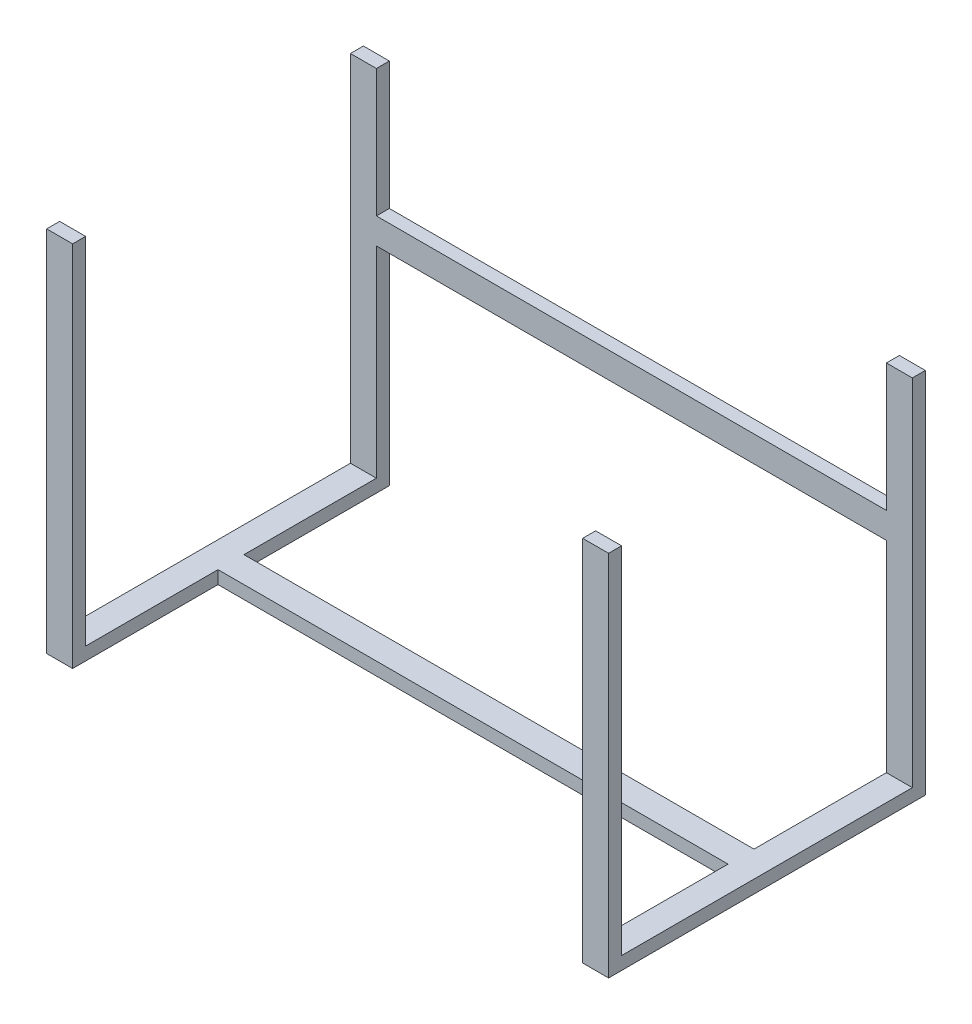
ISO-10303-21;
HEADER;
FILE_DESCRIPTION(('STEP AP214'),'2;1');
FILE_NAME('part.step','',(''),(''),'','','');
FILE_SCHEMA(('AUTOMOTIVE_DESIGN { 1 0 10303 214 1 1 1 1 }'));
ENDSEC;
DATA;
#1=APPLICATION_CONTEXT('core data for automotive mechanical design processes');
#2=APPLICATION_PROTOCOL_DEFINITION('international standard','automotive_design',2000,#1);
#3=PRODUCT_CONTEXT('',#1,'mechanical');
#4=PRODUCT('Part','Part','',(#3));
#5=PRODUCT_RELATED_PRODUCT_CATEGORY('part','',(#4));
#6=PRODUCT_DEFINITION_FORMATION('','',#4);
#7=PRODUCT_DEFINITION_CONTEXT('part definition',#1,'design');
#8=PRODUCT_DEFINITION('design','',#6,#7);
#9=PRODUCT_DEFINITION_SHAPE('','',#8);
#10=(LENGTH_UNIT() NAMED_UNIT(*) SI_UNIT(.MILLI.,.METRE.));
#11=(NAMED_UNIT(*) PLANE_ANGLE_UNIT() SI_UNIT($,.RADIAN.));
#12=(NAMED_UNIT(*) SI_UNIT($,.STERADIAN.) SOLID_ANGLE_UNIT());
#13=UNCERTAINTY_MEASURE_WITH_UNIT(LENGTH_MEASURE(1.E-05),#10,'distance_accuracy_value','');
#14=(GEOMETRIC_REPRESENTATION_CONTEXT(3) GLOBAL_UNCERTAINTY_ASSIGNED_CONTEXT((#13)) GLOBAL_UNIT_ASSIGNED_CONTEXT((#10,
#11,#12)) REPRESENTATION_CONTEXT('',''));
#15=CARTESIAN_POINT('',(0.,0.,0.));
#16=DIRECTION('',(0.,0.,1.));
#17=DIRECTION('',(1.,0.,0.));
#18=AXIS2_PLACEMENT_3D('',#15,#16,#17);
#19=CARTESIAN_POINT('',(50.8,0.,0.));
#20=DIRECTION('',(-1.,0.,0.));
#21=DIRECTION('',(0.,0.,1.));
#22=AXIS2_PLACEMENT_3D('',#19,#20,#21);
#23=PLANE('',#22);
#24=DIRECTION('',(0.,0.,-1.));
#25=VECTOR('',#24,1.);
#26=CARTESIAN_POINT('',(50.8,419.2,25.4));
#27=LINE('',#26,#25);
#28=CARTESIAN_POINT('',(50.8,419.2,25.4));
#29=VERTEX_POINT('',#28);
#30=CARTESIAN_POINT('',(50.8,419.2,0.));
#31=VERTEX_POINT('',#30);
#32=EDGE_CURVE('E51',#29,#31,#27,.T.);
#33=ORIENTED_EDGE('',*,*,#32,.F.);
#34=DIRECTION('',(0.,-1.,0.));
#35=VECTOR('',#34,1.);
#36=CARTESIAN_POINT('',(50.8,25.4,25.4));
#37=LINE('',#36,#35);
#38=CARTESIAN_POINT('',(50.8,25.4,25.4));
#39=VERTEX_POINT('',#38);
#40=EDGE_CURVE('E217',#29,#39,#37,.T.);
#41=ORIENTED_EDGE('',*,*,#40,.T.);
#42=DIRECTION('',(0.,0.,1.));
#43=VECTOR('',#42,1.);
#44=CARTESIAN_POINT('',(50.8,25.3999999999999,594.6));
#45=LINE('',#44,#43);
#46=CARTESIAN_POINT('',(50.8,25.4,284.6));
#47=VERTEX_POINT('',#46);
#48=EDGE_CURVE('E322',#39,#47,#45,.T.);
#49=ORIENTED_EDGE('',*,*,#48,.T.);
#50=DIRECTION('',(0.,1.,0.));
#51=VECTOR('',#50,1.);
#52=CARTESIAN_POINT('',(50.8,25.4,284.6));
#53=LINE('',#52,#51);
#54=CARTESIAN_POINT('',(50.8,0.,284.6));
#55=VERTEX_POINT('',#54);
#56=EDGE_CURVE('E301',#55,#47,#53,.T.);
#57=ORIENTED_EDGE('',*,*,#56,.F.);
#58=DIRECTION('',(0.,0.,-1.));
#59=VECTOR('',#58,1.);
#60=CARTESIAN_POINT('',(50.8,0.,0.));
#61=LINE('',#60,#59);
#62=CARTESIAN_POINT('',(50.8,0.,0.));
#63=VERTEX_POINT('',#62);
#64=EDGE_CURVE('E330',#55,#63,#61,.T.);
#65=ORIENTED_EDGE('',*,*,#64,.T.);
#66=DIRECTION('',(0.,1.,0.));
#67=VECTOR('',#66,1.);
#68=CARTESIAN_POINT('',(50.8,720.,0.));
#69=LINE('',#68,#67);
#70=EDGE_CURVE('E334',#63,#31,#69,.T.);
#71=ORIENTED_EDGE('',*,*,#70,.T.);
#72=EDGE_LOOP('',(#33,#41,#49,#57,#65,#71));
#73=FACE_BOUND('',#72,.T.);
#74=ADVANCED_FACE('F36',(#73),#23,.F.);
#75=DIRECTION('',(0.,0.,1.));
#76=VECTOR('',#75,1.);
#77=CARTESIAN_POINT('',(50.8,470.,25.4));
#78=LINE('',#77,#76);
#79=CARTESIAN_POINT('',(50.8,470.,0.));
#80=VERTEX_POINT('',#79);
#81=CARTESIAN_POINT('',(50.8,470.,25.4));
#82=VERTEX_POINT('',#81);
#83=EDGE_CURVE('E407',#80,#82,#78,.T.);
#84=ORIENTED_EDGE('',*,*,#83,.F.);
#85=CARTESIAN_POINT('',(50.8,720.,0.));
#86=VERTEX_POINT('',#85);
#87=EDGE_CURVE('E333',#80,#86,#69,.T.);
#88=ORIENTED_EDGE('',*,*,#87,.T.);
#89=DIRECTION('',(0.,0.,1.));
#90=VECTOR('',#89,1.);
#91=CARTESIAN_POINT('',(50.8,720.,25.4));
#92=LINE('',#91,#90);
#93=CARTESIAN_POINT('',(50.8,720.,25.4));
#94=VERTEX_POINT('',#93);
#95=EDGE_CURVE('E317',#86,#94,#92,.T.);
#96=ORIENTED_EDGE('',*,*,#95,.T.);
#97=EDGE_CURVE('E59',#94,#82,#37,.T.);
#98=ORIENTED_EDGE('',*,*,#97,.T.);
#99=EDGE_LOOP('',(#84,#88,#96,#98));
#100=FACE_BOUND('',#99,.T.);
#101=ADVANCED_FACE('F416',(#100),#23,.F.);
#102=CARTESIAN_POINT('',(1049.2,0.,0.));
#103=DIRECTION('',(1.,0.,0.));
#104=DIRECTION('',(0.,0.,1.));
#105=AXIS2_PLACEMENT_3D('',#102,#103,#104);
#106=PLANE('',#105);
#107=DIRECTION('',(0.,0.,-1.));
#108=VECTOR('',#107,1.);
#109=CARTESIAN_POINT('',(1049.2,419.2,25.4));
#110=LINE('',#109,#108);
#111=CARTESIAN_POINT('',(1049.2,419.2,25.4));
#112=VERTEX_POINT('',#111);
#113=CARTESIAN_POINT('',(1049.2,419.2,0.));
#114=VERTEX_POINT('',#113);
#115=EDGE_CURVE('E198',#112,#114,#110,.T.);
#116=ORIENTED_EDGE('',*,*,#115,.T.);
#117=DIRECTION('',(0.,1.,0.));
#118=VECTOR('',#117,1.);
#119=CARTESIAN_POINT('',(1049.2,720.,0.));
#120=LINE('',#119,#118);
#121=CARTESIAN_POINT('',(1049.2,0.,0.));
#122=VERTEX_POINT('',#121);
#123=EDGE_CURVE('E250',#122,#114,#120,.T.);
#124=ORIENTED_EDGE('',*,*,#123,.F.);
#125=DIRECTION('',(0.,0.,-1.));
#126=VECTOR('',#125,1.);
#127=CARTESIAN_POINT('',(1049.2,0.,0.));
#128=LINE('',#127,#126);
#129=CARTESIAN_POINT('',(1049.2,0.,284.6));
#130=VERTEX_POINT('',#129);
#131=EDGE_CURVE('E245',#130,#122,#128,.T.);
#132=ORIENTED_EDGE('',*,*,#131,.F.);
#133=DIRECTION('',(0.,1.,0.));
#134=VECTOR('',#133,1.);
#135=CARTESIAN_POINT('',(1049.2,25.4,284.6));
#136=LINE('',#135,#134);
#137=CARTESIAN_POINT('',(1049.2,25.4,284.6));
#138=VERTEX_POINT('',#137);
#139=EDGE_CURVE('E257',#130,#138,#136,.T.);
#140=ORIENTED_EDGE('',*,*,#139,.T.);
#141=DIRECTION('',(0.,0.,1.));
#142=VECTOR('',#141,1.);
#143=CARTESIAN_POINT('',(1049.2,25.3999999999999,594.6));
#144=LINE('',#143,#142);
#145=CARTESIAN_POINT('',(1049.2,25.4,25.4));
#146=VERTEX_POINT('',#145);
#147=EDGE_CURVE('E224',#146,#138,#144,.T.);
#148=ORIENTED_EDGE('',*,*,#147,.F.);
#149=DIRECTION('',(0.,-1.,0.));
#150=VECTOR('',#149,1.);
#151=CARTESIAN_POINT('',(1049.2,25.4,25.4));
#152=LINE('',#151,#150);
#153=EDGE_CURVE('E214',#112,#146,#152,.T.);
#154=ORIENTED_EDGE('',*,*,#153,.F.);
#155=EDGE_LOOP('',(#116,#124,#132,#140,#148,#154));
#156=FACE_BOUND('',#155,.T.);
#157=ADVANCED_FACE('F221',(#156),#106,.F.);
#158=DIRECTION('',(0.,0.,1.));
#159=VECTOR('',#158,1.);
#160=CARTESIAN_POINT('',(1049.2,470.,25.4));
#161=LINE('',#160,#159);
#162=CARTESIAN_POINT('',(1049.2,470.,0.));
#163=VERTEX_POINT('',#162);
#164=CARTESIAN_POINT('',(1049.2,470.,25.4));
#165=VERTEX_POINT('',#164);
#166=EDGE_CURVE('E209',#163,#165,#161,.T.);
#167=ORIENTED_EDGE('',*,*,#166,.T.);
#168=CARTESIAN_POINT('',(1049.2,720.,25.4));
#169=VERTEX_POINT('',#168);
#170=EDGE_CURVE('E225',#169,#165,#152,.T.);
#171=ORIENTED_EDGE('',*,*,#170,.F.);
#172=DIRECTION('',(0.,0.,1.));
#173=VECTOR('',#172,1.);
#174=CARTESIAN_POINT('',(1049.2,720.,25.4));
#175=LINE('',#174,#173);
#176=CARTESIAN_POINT('',(1049.2,720.,0.));
#177=VERTEX_POINT('',#176);
#178=EDGE_CURVE('E226',#177,#169,#175,.T.);
#179=ORIENTED_EDGE('',*,*,#178,.F.);
#180=EDGE_CURVE('E249',#163,#177,#120,.T.);
#181=ORIENTED_EDGE('',*,*,#180,.F.);
#182=EDGE_LOOP('',(#167,#171,#179,#181));
#183=FACE_BOUND('',#182,.T.);
#184=ADVANCED_FACE('F427',(#183),#106,.F.);
#185=DIRECTION('',(0.,-1.,0.));
#186=VECTOR('',#185,1.);
#187=CARTESIAN_POINT('',(50.8,25.4,335.4));
#188=LINE('',#187,#186);
#189=CARTESIAN_POINT('',(50.8,25.3999999999999,335.4));
#190=VERTEX_POINT('',#189);
#191=CARTESIAN_POINT('',(50.8,0.,335.4));
#192=VERTEX_POINT('',#191);
#193=EDGE_CURVE('E298',#190,#192,#188,.T.);
#194=ORIENTED_EDGE('',*,*,#193,.F.);
#195=CARTESIAN_POINT('',(50.8,25.3999999999999,594.6));
#196=VERTEX_POINT('',#195);
#197=EDGE_CURVE('E321',#190,#196,#45,.T.);
#198=ORIENTED_EDGE('',*,*,#197,.T.);
#199=DIRECTION('',(0.,1.,0.));
#200=VECTOR('',#199,1.);
#201=CARTESIAN_POINT('',(50.8,720.,594.6));
#202=LINE('',#201,#200);
#203=CARTESIAN_POINT('',(50.8,720.,594.6));
#204=VERTEX_POINT('',#203);
#205=EDGE_CURVE('E324',#196,#204,#202,.T.);
#206=ORIENTED_EDGE('',*,*,#205,.T.);
#207=DIRECTION('',(0.,0.,1.));
#208=VECTOR('',#207,1.);
#209=CARTESIAN_POINT('',(50.8,720.,620.));
#210=LINE('',#209,#208);
#211=CARTESIAN_POINT('',(50.8,720.,620.));
#212=VERTEX_POINT('',#211);
#213=EDGE_CURVE('E326',#204,#212,#210,.T.);
#214=ORIENTED_EDGE('',*,*,#213,.T.);
#215=DIRECTION('',(0.,-1.,0.));
#216=VECTOR('',#215,1.);
#217=CARTESIAN_POINT('',(50.8,0.,620.));
#218=LINE('',#217,#216);
#219=CARTESIAN_POINT('',(50.8,0.,620.));
#220=VERTEX_POINT('',#219);
#221=EDGE_CURVE('E328',#212,#220,#218,.T.);
#222=ORIENTED_EDGE('',*,*,#221,.T.);
#223=EDGE_CURVE('E331',#220,#192,#61,.T.);
#224=ORIENTED_EDGE('',*,*,#223,.T.);
#225=EDGE_LOOP('',(#194,#198,#206,#214,#222,#224));
#226=FACE_BOUND('',#225,.T.);
#227=ADVANCED_FACE('F390',(#226),#23,.F.);
#228=CARTESIAN_POINT('',(50.8,720.,25.4));
#229=DIRECTION('',(0.,-1.,0.));
#230=DIRECTION('',(0.,0.,-1.));
#231=AXIS2_PLACEMENT_3D('',#228,#229,#230);
#232=PLANE('',#231);
#233=DIRECTION('',(0.,0.,1.));
#234=VECTOR('',#233,1.);
#235=CARTESIAN_POINT('',(0.,720.,25.4));
#236=LINE('',#235,#234);
#237=CARTESIAN_POINT('',(0.,720.,0.));
#238=VERTEX_POINT('',#237);
#239=CARTESIAN_POINT('',(0.,720.,25.4));
#240=VERTEX_POINT('',#239);
#241=EDGE_CURVE('E316',#238,#240,#236,.T.);
#242=ORIENTED_EDGE('',*,*,#241,.T.);
#243=DIRECTION('',(-1.,0.,0.));
#244=VECTOR('',#243,1.);
#245=CARTESIAN_POINT('',(50.8,720.,25.4));
#246=LINE('',#245,#244);
#247=EDGE_CURVE('E11',#94,#240,#246,.T.);
#248=ORIENTED_EDGE('',*,*,#247,.F.);
#249=ORIENTED_EDGE('',*,*,#95,.F.);
#250=DIRECTION('',(-1.,0.,0.));
#251=VECTOR('',#250,1.);
#252=CARTESIAN_POINT('',(50.8,720.,0.));
#253=LINE('',#252,#251);
#254=EDGE_CURVE('E336',#86,#238,#253,.T.);
#255=ORIENTED_EDGE('',*,*,#254,.T.);
#256=EDGE_LOOP('',(#242,#248,#249,#255));
#257=FACE_BOUND('',#256,.T.);
#258=ADVANCED_FACE('F38',(#257),#232,.F.);
#259=CARTESIAN_POINT('',(50.8,25.4,25.4));
#260=DIRECTION('',(0.,0.,-1.));
#261=DIRECTION('',(0.,1.,0.));
#262=AXIS2_PLACEMENT_3D('',#259,#260,#261);
#263=PLANE('',#262);
#264=DIRECTION('',(0.,-1.,0.));
#265=VECTOR('',#264,1.);
#266=CARTESIAN_POINT('',(0.,25.4,25.4));
#267=LINE('',#266,#265);
#268=CARTESIAN_POINT('',(0.,25.4,25.4));
#269=VERTEX_POINT('',#268);
#270=EDGE_CURVE('E339',#240,#269,#267,.T.);
#271=ORIENTED_EDGE('',*,*,#270,.T.);
#272=DIRECTION('',(-1.,0.,0.));
#273=VECTOR('',#272,1.);
#274=CARTESIAN_POINT('',(50.8,25.4,25.4));
#275=LINE('',#274,#273);
#276=EDGE_CURVE('E44',#39,#269,#275,.T.);
#277=ORIENTED_EDGE('',*,*,#276,.F.);
#278=ORIENTED_EDGE('',*,*,#40,.F.);
#279=DIRECTION('',(-1.,0.,0.));
#280=VECTOR('',#279,1.);
#281=CARTESIAN_POINT('',(1105.99612662849,419.2,25.4));
#282=LINE('',#281,#280);
#283=EDGE_CURVE('E201',#112,#29,#282,.T.);
#284=ORIENTED_EDGE('',*,*,#283,.F.);
#285=ORIENTED_EDGE('',*,*,#153,.T.);
#286=DIRECTION('',(1.,0.,0.));
#287=VECTOR('',#286,1.);
#288=CARTESIAN_POINT('',(1049.2,25.4,25.4));
#289=LINE('',#288,#287);
#290=CARTESIAN_POINT('',(1100.,25.4,25.4));
#291=VERTEX_POINT('',#290);
#292=EDGE_CURVE('E293',#146,#291,#289,.T.);
#293=ORIENTED_EDGE('',*,*,#292,.T.);
#294=DIRECTION('',(0.,-1.,0.));
#295=VECTOR('',#294,1.);
#296=CARTESIAN_POINT('',(1100.,25.4,25.4));
#297=LINE('',#296,#295);
#298=CARTESIAN_POINT('',(1100.,720.,25.4));
#299=VERTEX_POINT('',#298);
#300=EDGE_CURVE('E256',#299,#291,#297,.T.);
#301=ORIENTED_EDGE('',*,*,#300,.F.);
#302=DIRECTION('',(1.,0.,0.));
#303=VECTOR('',#302,1.);
#304=CARTESIAN_POINT('',(1049.2,720.,25.4));
#305=LINE('',#304,#303);
#306=EDGE_CURVE('E295',#169,#299,#305,.T.);
#307=ORIENTED_EDGE('',*,*,#306,.F.);
#308=ORIENTED_EDGE('',*,*,#170,.T.);
#309=DIRECTION('',(-1.,0.,0.));
#310=VECTOR('',#309,1.);
#311=CARTESIAN_POINT('',(1105.99612662849,470.,25.4));
#312=LINE('',#311,#310);
#313=EDGE_CURVE('E218',#165,#82,#312,.T.);
#314=ORIENTED_EDGE('',*,*,#313,.T.);
#315=ORIENTED_EDGE('',*,*,#97,.F.);
#316=ORIENTED_EDGE('',*,*,#247,.T.);
#317=EDGE_LOOP('',(#271,#277,#278,#284,#285,#293,#301,#307,#308,#314,#315,#316));
#318=FACE_BOUND('',#317,.T.);
#319=ADVANCED_FACE('F212',(#318),#263,.F.);
#320=CARTESIAN_POINT('',(50.8,25.3999999999999,594.6));
#321=DIRECTION('',(0.,-1.,0.));
#322=DIRECTION('',(0.,0.,-1.));
#323=AXIS2_PLACEMENT_3D('',#320,#321,#322);
#324=PLANE('',#323);
#325=DIRECTION('',(0.,0.,1.));
#326=VECTOR('',#325,1.);
#327=CARTESIAN_POINT('',(0.,25.3999999999999,594.6));
#328=LINE('',#327,#326);
#329=CARTESIAN_POINT('',(0.,25.3999999999999,594.6));
#330=VERTEX_POINT('',#329);
#331=EDGE_CURVE('E341',#269,#330,#328,.T.);
#332=ORIENTED_EDGE('',*,*,#331,.T.);
#333=DIRECTION('',(-1.,0.,0.));
#334=VECTOR('',#333,1.);
#335=CARTESIAN_POINT('',(50.8,25.3999999999999,594.6));
#336=LINE('',#335,#334);
#337=EDGE_CURVE('E366',#196,#330,#336,.T.);
#338=ORIENTED_EDGE('',*,*,#337,.F.);
#339=ORIENTED_EDGE('',*,*,#197,.F.);
#340=DIRECTION('',(-1.,0.,0.));
#341=VECTOR('',#340,1.);
#342=CARTESIAN_POINT('',(550.,25.4,335.4));
#343=LINE('',#342,#341);
#344=CARTESIAN_POINT('',(1049.2,25.3999999999999,335.4));
#345=VERTEX_POINT('',#344);
#346=EDGE_CURVE('E304',#345,#190,#343,.T.);
#347=ORIENTED_EDGE('',*,*,#346,.F.);
#348=CARTESIAN_POINT('',(1049.2,25.3999999999999,594.6));
#349=VERTEX_POINT('',#348);
#350=EDGE_CURVE('E229',#345,#349,#144,.T.);
#351=ORIENTED_EDGE('',*,*,#350,.T.);
#352=DIRECTION('',(1.,0.,0.));
#353=VECTOR('',#352,1.);
#354=CARTESIAN_POINT('',(1049.2,25.3999999999999,594.6));
#355=LINE('',#354,#353);
#356=CARTESIAN_POINT('',(1100.,25.3999999999999,594.6));
#357=VERTEX_POINT('',#356);
#358=EDGE_CURVE('E290',#349,#357,#355,.T.);
#359=ORIENTED_EDGE('',*,*,#358,.T.);
#360=DIRECTION('',(0.,0.,1.));
#361=VECTOR('',#360,1.);
#362=CARTESIAN_POINT('',(1100.,25.3999999999999,594.6));
#363=LINE('',#362,#361);
#364=EDGE_CURVE('E260',#291,#357,#363,.T.);
#365=ORIENTED_EDGE('',*,*,#364,.F.);
#366=ORIENTED_EDGE('',*,*,#292,.F.);
#367=ORIENTED_EDGE('',*,*,#147,.T.);
#368=DIRECTION('',(-1.,0.,0.));
#369=VECTOR('',#368,1.);
#370=CARTESIAN_POINT('',(550.,25.4,284.6));
#371=LINE('',#370,#369);
#372=EDGE_CURVE('E307',#138,#47,#371,.T.);
#373=ORIENTED_EDGE('',*,*,#372,.T.);
#374=ORIENTED_EDGE('',*,*,#48,.F.);
#375=ORIENTED_EDGE('',*,*,#276,.T.);
#376=EDGE_LOOP('',(#332,#338,#339,#347,#351,#359,#365,#366,#367,#373,#374,#375));
#377=FACE_BOUND('',#376,.T.);
#378=ADVANCED_FACE('F372',(#377),#324,.F.);
#379=CARTESIAN_POINT('',(50.8,720.,594.6));
#380=DIRECTION('',(0.,0.,1.));
#381=DIRECTION('',(0.,-1.,0.));
#382=AXIS2_PLACEMENT_3D('',#379,#380,#381);
#383=PLANE('',#382);
#384=DIRECTION('',(0.,1.,0.));
#385=VECTOR('',#384,1.);
#386=CARTESIAN_POINT('',(0.,720.,594.6));
#387=LINE('',#386,#385);
#388=CARTESIAN_POINT('',(0.,720.,594.6));
#389=VERTEX_POINT('',#388);
#390=EDGE_CURVE('E343',#330,#389,#387,.T.);
#391=ORIENTED_EDGE('',*,*,#390,.T.);
#392=DIRECTION('',(-1.,0.,0.));
#393=VECTOR('',#392,1.);
#394=CARTESIAN_POINT('',(50.8,720.,594.6));
#395=LINE('',#394,#393);
#396=EDGE_CURVE('E363',#204,#389,#395,.T.);
#397=ORIENTED_EDGE('',*,*,#396,.F.);
#398=ORIENTED_EDGE('',*,*,#205,.F.);
#399=ORIENTED_EDGE('',*,*,#337,.T.);
#400=EDGE_LOOP('',(#391,#397,#398,#399));
#401=FACE_BOUND('',#400,.T.);
#402=ADVANCED_FACE('F382',(#401),#383,.F.);
#403=CARTESIAN_POINT('',(50.8,720.,620.));
#404=DIRECTION('',(0.,-1.,0.));
#405=DIRECTION('',(0.,0.,-1.));
#406=AXIS2_PLACEMENT_3D('',#403,#404,#405);
#407=PLANE('',#406);
#408=DIRECTION('',(0.,0.,1.));
#409=VECTOR('',#408,1.);
#410=CARTESIAN_POINT('',(0.,720.,620.));
#411=LINE('',#410,#409);
#412=CARTESIAN_POINT('',(0.,720.,620.));
#413=VERTEX_POINT('',#412);
#414=EDGE_CURVE('E345',#389,#413,#411,.T.);
#415=ORIENTED_EDGE('',*,*,#414,.T.);
#416=DIRECTION('',(-1.,0.,0.));
#417=VECTOR('',#416,1.);
#418=CARTESIAN_POINT('',(50.8,720.,620.));
#419=LINE('',#418,#417);
#420=EDGE_CURVE('E360',#212,#413,#419,.T.);
#421=ORIENTED_EDGE('',*,*,#420,.F.);
#422=ORIENTED_EDGE('',*,*,#213,.F.);
#423=ORIENTED_EDGE('',*,*,#396,.T.);
#424=EDGE_LOOP('',(#415,#421,#422,#423));
#425=FACE_BOUND('',#424,.T.);
#426=ADVANCED_FACE('F386',(#425),#407,.F.);
#427=CARTESIAN_POINT('',(50.8,0.,620.));
#428=DIRECTION('',(0.,0.,-1.));
#429=DIRECTION('',(-1.,0.,0.));
#430=AXIS2_PLACEMENT_3D('',#427,#428,#429);
#431=PLANE('',#430);
#432=DIRECTION('',(0.,-1.,0.));
#433=VECTOR('',#432,1.);
#434=CARTESIAN_POINT('',(0.,0.,620.));
#435=LINE('',#434,#433);
#436=CARTESIAN_POINT('',(0.,0.,620.));
#437=VERTEX_POINT('',#436);
#438=EDGE_CURVE('E347',#413,#437,#435,.T.);
#439=ORIENTED_EDGE('',*,*,#438,.T.);
#440=DIRECTION('',(-1.,0.,0.));
#441=VECTOR('',#440,1.);
#442=CARTESIAN_POINT('',(50.8,0.,620.));
#443=LINE('',#442,#441);
#444=EDGE_CURVE('E357',#220,#437,#443,.T.);
#445=ORIENTED_EDGE('',*,*,#444,.F.);
#446=ORIENTED_EDGE('',*,*,#221,.F.);
#447=ORIENTED_EDGE('',*,*,#420,.T.);
#448=EDGE_LOOP('',(#439,#445,#446,#447));
#449=FACE_BOUND('',#448,.T.);
#450=ADVANCED_FACE('F446',(#449),#431,.F.);
#451=CARTESIAN_POINT('',(50.8,0.,0.));
#452=DIRECTION('',(0.,1.,0.));
#453=DIRECTION('',(0.,0.,1.));
#454=AXIS2_PLACEMENT_3D('',#451,#452,#453);
#455=PLANE('',#454);
#456=DIRECTION('',(0.,0.,-1.));
#457=VECTOR('',#456,1.);
#458=CARTESIAN_POINT('',(0.,0.,0.));
#459=LINE('',#458,#457);
#460=CARTESIAN_POINT('',(0.,0.,0.));
#461=VERTEX_POINT('',#460);
#462=EDGE_CURVE('E349',#437,#461,#459,.T.);
#463=ORIENTED_EDGE('',*,*,#462,.T.);
#464=DIRECTION('',(-1.,0.,0.));
#465=VECTOR('',#464,1.);
#466=CARTESIAN_POINT('',(50.8,0.,0.));
#467=LINE('',#466,#465);
#468=EDGE_CURVE('E354',#63,#461,#467,.T.);
#469=ORIENTED_EDGE('',*,*,#468,.F.);
#470=ORIENTED_EDGE('',*,*,#64,.F.);
#471=DIRECTION('',(-1.,0.,0.));
#472=VECTOR('',#471,1.);
#473=CARTESIAN_POINT('',(550.,0.,284.6));
#474=LINE('',#473,#472);
#475=EDGE_CURVE('E310',#130,#55,#474,.T.);
#476=ORIENTED_EDGE('',*,*,#475,.F.);
#477=ORIENTED_EDGE('',*,*,#131,.T.);
#478=DIRECTION('',(1.,0.,0.));
#479=VECTOR('',#478,1.);
#480=CARTESIAN_POINT('',(1049.2,0.,0.));
#481=LINE('',#480,#479);
#482=CARTESIAN_POINT('',(1100.,0.,0.));
#483=VERTEX_POINT('',#482);
#484=EDGE_CURVE('E278',#122,#483,#481,.T.);
#485=ORIENTED_EDGE('',*,*,#484,.T.);
#486=DIRECTION('',(0.,0.,-1.));
#487=VECTOR('',#486,1.);
#488=CARTESIAN_POINT('',(1100.,0.,0.));
#489=LINE('',#488,#487);
#490=CARTESIAN_POINT('',(1100.,0.,620.));
#491=VERTEX_POINT('',#490);
#492=EDGE_CURVE('E272',#491,#483,#489,.T.);
#493=ORIENTED_EDGE('',*,*,#492,.F.);
#494=DIRECTION('',(1.,0.,0.));
#495=VECTOR('',#494,1.);
#496=CARTESIAN_POINT('',(1049.2,0.,620.));
#497=LINE('',#496,#495);
#498=CARTESIAN_POINT('',(1049.2,0.,620.));
#499=VERTEX_POINT('',#498);
#500=EDGE_CURVE('E281',#499,#491,#497,.T.);
#501=ORIENTED_EDGE('',*,*,#500,.F.);
#502=CARTESIAN_POINT('',(1049.2,0.,335.4));
#503=VERTEX_POINT('',#502);
#504=EDGE_CURVE('E246',#499,#503,#128,.T.);
#505=ORIENTED_EDGE('',*,*,#504,.T.);
#506=DIRECTION('',(-1.,0.,0.));
#507=VECTOR('',#506,1.);
#508=CARTESIAN_POINT('',(550.,0.,335.4));
#509=LINE('',#508,#507);
#510=EDGE_CURVE('E313',#503,#192,#509,.T.);
#511=ORIENTED_EDGE('',*,*,#510,.T.);
#512=ORIENTED_EDGE('',*,*,#223,.F.);
#513=ORIENTED_EDGE('',*,*,#444,.T.);
#514=EDGE_LOOP('',(#463,#469,#470,#476,#477,#485,#493,#501,#505,#511,#512,#513));
#515=FACE_BOUND('',#514,.T.);
#516=ADVANCED_FACE('F437',(#515),#455,.F.);
#517=CARTESIAN_POINT('',(50.8,720.,0.));
#518=DIRECTION('',(0.,0.,1.));
#519=DIRECTION('',(0.,-1.,0.));
#520=AXIS2_PLACEMENT_3D('',#517,#518,#519);
#521=PLANE('',#520);
#522=DIRECTION('',(0.,1.,0.));
#523=VECTOR('',#522,1.);
#524=CARTESIAN_POINT('',(0.,720.,0.));
#525=LINE('',#524,#523);
#526=EDGE_CURVE('E319',#461,#238,#525,.T.);
#527=ORIENTED_EDGE('',*,*,#526,.T.);
#528=ORIENTED_EDGE('',*,*,#254,.F.);
#529=ORIENTED_EDGE('',*,*,#87,.F.);
#530=DIRECTION('',(-1.,0.,0.));
#531=VECTOR('',#530,1.);
#532=CARTESIAN_POINT('',(1105.99612662849,470.,0.));
#533=LINE('',#532,#531);
#534=EDGE_CURVE('E404',#163,#80,#533,.T.);
#535=ORIENTED_EDGE('',*,*,#534,.F.);
#536=ORIENTED_EDGE('',*,*,#180,.T.);
#537=DIRECTION('',(1.,0.,0.));
#538=VECTOR('',#537,1.);
#539=CARTESIAN_POINT('',(1049.2,720.,0.));
#540=LINE('',#539,#538);
#541=CARTESIAN_POINT('',(1100.,720.,0.));
#542=VERTEX_POINT('',#541);
#543=EDGE_CURVE('E252',#177,#542,#540,.T.);
#544=ORIENTED_EDGE('',*,*,#543,.T.);
#545=DIRECTION('',(0.,1.,0.));
#546=VECTOR('',#545,1.);
#547=CARTESIAN_POINT('',(1100.,720.,0.));
#548=LINE('',#547,#546);
#549=EDGE_CURVE('E231',#483,#542,#548,.T.);
#550=ORIENTED_EDGE('',*,*,#549,.F.);
#551=ORIENTED_EDGE('',*,*,#484,.F.);
#552=ORIENTED_EDGE('',*,*,#123,.T.);
#553=DIRECTION('',(-1.,0.,0.));
#554=VECTOR('',#553,1.);
#555=CARTESIAN_POINT('',(1105.99612662849,419.2,0.));
#556=LINE('',#555,#554);
#557=EDGE_CURVE('E203',#114,#31,#556,.T.);
#558=ORIENTED_EDGE('',*,*,#557,.T.);
#559=ORIENTED_EDGE('',*,*,#70,.F.);
#560=ORIENTED_EDGE('',*,*,#468,.T.);
#561=EDGE_LOOP('',(#527,#528,#529,#535,#536,#544,#550,#551,#552,#558,#559,#560));
#562=FACE_BOUND('',#561,.T.);
#563=ADVANCED_FACE('F421',(#562),#521,.F.);
#564=CARTESIAN_POINT('',(0.,0.,0.));
#565=DIRECTION('',(-1.,0.,0.));
#566=DIRECTION('',(0.,0.,1.));
#567=AXIS2_PLACEMENT_3D('',#564,#565,#566);
#568=PLANE('',#567);
#569=ORIENTED_EDGE('',*,*,#241,.F.);
#570=ORIENTED_EDGE('',*,*,#526,.F.);
#571=ORIENTED_EDGE('',*,*,#462,.F.);
#572=ORIENTED_EDGE('',*,*,#438,.F.);
#573=ORIENTED_EDGE('',*,*,#414,.F.);
#574=ORIENTED_EDGE('',*,*,#390,.F.);
#575=ORIENTED_EDGE('',*,*,#331,.F.);
#576=ORIENTED_EDGE('',*,*,#270,.F.);
#577=EDGE_LOOP('',(#569,#570,#571,#572,#573,#574,#575,#576));
#578=FACE_BOUND('',#577,.T.);
#579=ADVANCED_FACE('F377',(#578),#568,.T.);
#580=CARTESIAN_POINT('',(550.,25.4,335.4));
#581=DIRECTION('',(0.,0.,-1.));
#582=DIRECTION('',(-1.,0.,0.));
#583=AXIS2_PLACEMENT_3D('',#580,#581,#582);
#584=PLANE('',#583);
#585=ORIENTED_EDGE('',*,*,#193,.T.);
#586=ORIENTED_EDGE('',*,*,#510,.F.);
#587=DIRECTION('',(0.,-1.,0.));
#588=VECTOR('',#587,1.);
#589=CARTESIAN_POINT('',(1049.2,25.4,335.4));
#590=LINE('',#589,#588);
#591=EDGE_CURVE('E208',#345,#503,#590,.T.);
#592=ORIENTED_EDGE('',*,*,#591,.F.);
#593=ORIENTED_EDGE('',*,*,#346,.T.);
#594=EDGE_LOOP('',(#585,#586,#592,#593));
#595=FACE_BOUND('',#594,.T.);
#596=ADVANCED_FACE('F397',(#595),#584,.F.);
#597=CARTESIAN_POINT('',(550.,25.4,284.6));
#598=DIRECTION('',(0.,0.,1.));
#599=DIRECTION('',(1.,0.,0.));
#600=AXIS2_PLACEMENT_3D('',#597,#598,#599);
#601=PLANE('',#600);
#602=ORIENTED_EDGE('',*,*,#56,.T.);
#603=ORIENTED_EDGE('',*,*,#372,.F.);
#604=ORIENTED_EDGE('',*,*,#139,.F.);
#605=ORIENTED_EDGE('',*,*,#475,.T.);
#606=EDGE_LOOP('',(#602,#603,#604,#605));
#607=FACE_BOUND('',#606,.T.);
#608=ADVANCED_FACE('F458',(#607),#601,.F.);
#609=ORIENTED_EDGE('',*,*,#591,.T.);
#610=ORIENTED_EDGE('',*,*,#504,.F.);
#611=DIRECTION('',(0.,-1.,0.));
#612=VECTOR('',#611,1.);
#613=CARTESIAN_POINT('',(1049.2,0.,620.));
#614=LINE('',#613,#612);
#615=CARTESIAN_POINT('',(1049.2,720.,620.));
#616=VERTEX_POINT('',#615);
#617=EDGE_CURVE('E242',#616,#499,#614,.T.);
#618=ORIENTED_EDGE('',*,*,#617,.F.);
#619=DIRECTION('',(0.,0.,1.));
#620=VECTOR('',#619,1.);
#621=CARTESIAN_POINT('',(1049.2,720.,620.));
#622=LINE('',#621,#620);
#623=CARTESIAN_POINT('',(1049.2,720.,594.6));
#624=VERTEX_POINT('',#623);
#625=EDGE_CURVE('E239',#624,#616,#622,.T.);
#626=ORIENTED_EDGE('',*,*,#625,.F.);
#627=DIRECTION('',(0.,1.,0.));
#628=VECTOR('',#627,1.);
#629=CARTESIAN_POINT('',(1049.2,720.,594.6));
#630=LINE('',#629,#628);
#631=EDGE_CURVE('E236',#349,#624,#630,.T.);
#632=ORIENTED_EDGE('',*,*,#631,.F.);
#633=ORIENTED_EDGE('',*,*,#350,.F.);
#634=EDGE_LOOP('',(#609,#610,#618,#626,#632,#633));
#635=FACE_BOUND('',#634,.T.);
#636=ADVANCED_FACE('F448',(#635),#106,.F.);
#637=CARTESIAN_POINT('',(1049.2,720.,25.4));
#638=DIRECTION('',(0.,-1.,0.));
#639=DIRECTION('',(0.,0.,-1.));
#640=AXIS2_PLACEMENT_3D('',#637,#638,#639);
#641=PLANE('',#640);
#642=DIRECTION('',(0.,0.,1.));
#643=VECTOR('',#642,1.);
#644=CARTESIAN_POINT('',(1100.,720.,25.4));
#645=LINE('',#644,#643);
#646=EDGE_CURVE('E253',#542,#299,#645,.T.);
#647=ORIENTED_EDGE('',*,*,#646,.F.);
#648=ORIENTED_EDGE('',*,*,#543,.F.);
#649=ORIENTED_EDGE('',*,*,#178,.T.);
#650=ORIENTED_EDGE('',*,*,#306,.T.);
#651=EDGE_LOOP('',(#647,#648,#649,#650));
#652=FACE_BOUND('',#651,.T.);
#653=ADVANCED_FACE('F432',(#652),#641,.F.);
#654=CARTESIAN_POINT('',(1049.2,720.,594.6));
#655=DIRECTION('',(0.,0.,1.));
#656=DIRECTION('',(0.,-1.,0.));
#657=AXIS2_PLACEMENT_3D('',#654,#655,#656);
#658=PLANE('',#657);
#659=DIRECTION('',(0.,1.,0.));
#660=VECTOR('',#659,1.);
#661=CARTESIAN_POINT('',(1100.,720.,594.6));
#662=LINE('',#661,#660);
#663=CARTESIAN_POINT('',(1100.,720.,594.6));
#664=VERTEX_POINT('',#663);
#665=EDGE_CURVE('E263',#357,#664,#662,.T.);
#666=ORIENTED_EDGE('',*,*,#665,.F.);
#667=ORIENTED_EDGE('',*,*,#358,.F.);
#668=ORIENTED_EDGE('',*,*,#631,.T.);
#669=DIRECTION('',(1.,0.,0.));
#670=VECTOR('',#669,1.);
#671=CARTESIAN_POINT('',(1049.2,720.,594.6));
#672=LINE('',#671,#670);
#673=EDGE_CURVE('E287',#624,#664,#672,.T.);
#674=ORIENTED_EDGE('',*,*,#673,.T.);
#675=EDGE_LOOP('',(#666,#667,#668,#674));
#676=FACE_BOUND('',#675,.T.);
#677=ADVANCED_FACE('F456',(#676),#658,.F.);
#678=CARTESIAN_POINT('',(1049.2,720.,620.));
#679=DIRECTION('',(0.,-1.,0.));
#680=DIRECTION('',(0.,0.,-1.));
#681=AXIS2_PLACEMENT_3D('',#678,#679,#680);
#682=PLANE('',#681);
#683=DIRECTION('',(0.,0.,1.));
#684=VECTOR('',#683,1.);
#685=CARTESIAN_POINT('',(1100.,720.,620.));
#686=LINE('',#685,#684);
#687=CARTESIAN_POINT('',(1100.,720.,620.));
#688=VERTEX_POINT('',#687);
#689=EDGE_CURVE('E266',#664,#688,#686,.T.);
#690=ORIENTED_EDGE('',*,*,#689,.F.);
#691=ORIENTED_EDGE('',*,*,#673,.F.);
#692=ORIENTED_EDGE('',*,*,#625,.T.);
#693=DIRECTION('',(1.,0.,0.));
#694=VECTOR('',#693,1.);
#695=CARTESIAN_POINT('',(1049.2,720.,620.));
#696=LINE('',#695,#694);
#697=EDGE_CURVE('E284',#616,#688,#696,.T.);
#698=ORIENTED_EDGE('',*,*,#697,.T.);
#699=EDGE_LOOP('',(#690,#691,#692,#698));
#700=FACE_BOUND('',#699,.T.);
#701=ADVANCED_FACE('F454',(#700),#682,.F.);
#702=CARTESIAN_POINT('',(1049.2,0.,620.));
#703=DIRECTION('',(0.,0.,-1.));
#704=DIRECTION('',(1.,0.,0.));
#705=AXIS2_PLACEMENT_3D('',#702,#703,#704);
#706=PLANE('',#705);
#707=DIRECTION('',(0.,-1.,0.));
#708=VECTOR('',#707,1.);
#709=CARTESIAN_POINT('',(1100.,0.,620.));
#710=LINE('',#709,#708);
#711=EDGE_CURVE('E269',#688,#491,#710,.T.);
#712=ORIENTED_EDGE('',*,*,#711,.F.);
#713=ORIENTED_EDGE('',*,*,#697,.F.);
#714=ORIENTED_EDGE('',*,*,#617,.T.);
#715=ORIENTED_EDGE('',*,*,#500,.T.);
#716=EDGE_LOOP('',(#712,#713,#714,#715));
#717=FACE_BOUND('',#716,.T.);
#718=ADVANCED_FACE('F452',(#717),#706,.F.);
#719=CARTESIAN_POINT('',(1100.,0.,0.));
#720=DIRECTION('',(1.,0.,0.));
#721=DIRECTION('',(0.,0.,1.));
#722=AXIS2_PLACEMENT_3D('',#719,#720,#721);
#723=PLANE('',#722);
#724=ORIENTED_EDGE('',*,*,#646,.T.);
#725=ORIENTED_EDGE('',*,*,#300,.T.);
#726=ORIENTED_EDGE('',*,*,#364,.T.);
#727=ORIENTED_EDGE('',*,*,#665,.T.);
#728=ORIENTED_EDGE('',*,*,#689,.T.);
#729=ORIENTED_EDGE('',*,*,#711,.T.);
#730=ORIENTED_EDGE('',*,*,#492,.T.);
#731=ORIENTED_EDGE('',*,*,#549,.T.);
#732=EDGE_LOOP('',(#724,#725,#726,#727,#728,#729,#730,#731));
#733=FACE_BOUND('',#732,.T.);
#734=ADVANCED_FACE('F434',(#733),#723,.T.);
#735=CARTESIAN_POINT('',(1105.99612662849,419.2,25.4));
#736=DIRECTION('',(0.,1.,0.));
#737=DIRECTION('',(0.,0.,1.));
#738=AXIS2_PLACEMENT_3D('',#735,#736,#737);
#739=PLANE('',#738);
#740=ORIENTED_EDGE('',*,*,#115,.F.);
#741=ORIENTED_EDGE('',*,*,#283,.T.);
#742=ORIENTED_EDGE('',*,*,#32,.T.);
#743=ORIENTED_EDGE('',*,*,#557,.F.);
#744=EDGE_LOOP('',(#740,#741,#742,#743));
#745=FACE_BOUND('',#744,.T.);
#746=ADVANCED_FACE('F200',(#745),#739,.F.);
#747=CARTESIAN_POINT('',(1105.99612662849,470.,25.4));
#748=DIRECTION('',(0.,-1.,0.));
#749=DIRECTION('',(0.,0.,-1.));
#750=AXIS2_PLACEMENT_3D('',#747,#748,#749);
#751=PLANE('',#750);
#752=ORIENTED_EDGE('',*,*,#166,.F.);
#753=ORIENTED_EDGE('',*,*,#534,.T.);
#754=ORIENTED_EDGE('',*,*,#83,.T.);
#755=ORIENTED_EDGE('',*,*,#313,.F.);
#756=EDGE_LOOP('',(#752,#753,#754,#755));
#757=FACE_BOUND('',#756,.T.);
#758=ADVANCED_FACE('F414',(#757),#751,.F.);
#759=CLOSED_SHELL('',(#74,#101,#157,#184,#227,#258,#319,#378,#402,#426,#450,#516,#563,#579,#596,
#608,#636,#653,#677,#701,#718,#734,#746,#758));
#760=MANIFOLD_SOLID_BREP('B2',#759);
#761=ADVANCED_BREP_SHAPE_REPRESENTATION('',(#18,#760),#14);
#762=SHAPE_DEFINITION_REPRESENTATION(#9,#761);
ENDSEC;
END-ISO-10303-21;
